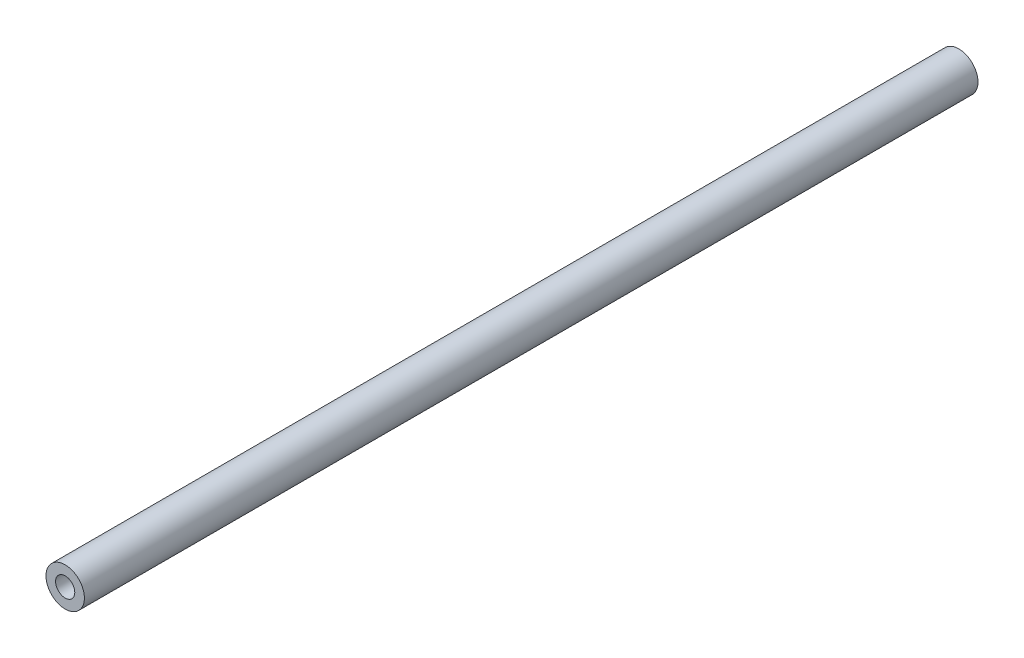
ISO-10303-21;
HEADER;
FILE_DESCRIPTION(('STEP AP214'),'2;1');
FILE_NAME('part.step','',(''),(''),'','','');
FILE_SCHEMA(('AUTOMOTIVE_DESIGN { 1 0 10303 214 1 1 1 1 }'));
ENDSEC;
DATA;
#1=APPLICATION_CONTEXT('core data for automotive mechanical design processes');
#2=APPLICATION_PROTOCOL_DEFINITION('international standard','automotive_design',2000,#1);
#3=PRODUCT_CONTEXT('',#1,'mechanical');
#4=PRODUCT('Part','Part','',(#3));
#5=PRODUCT_RELATED_PRODUCT_CATEGORY('part','',(#4));
#6=PRODUCT_DEFINITION_FORMATION('','',#4);
#7=PRODUCT_DEFINITION_CONTEXT('part definition',#1,'design');
#8=PRODUCT_DEFINITION('design','',#6,#7);
#9=PRODUCT_DEFINITION_SHAPE('','',#8);
#10=(LENGTH_UNIT() NAMED_UNIT(*) SI_UNIT(.MILLI.,.METRE.));
#11=(NAMED_UNIT(*) PLANE_ANGLE_UNIT() SI_UNIT($,.RADIAN.));
#12=(NAMED_UNIT(*) SI_UNIT($,.STERADIAN.) SOLID_ANGLE_UNIT());
#13=UNCERTAINTY_MEASURE_WITH_UNIT(LENGTH_MEASURE(1.E-05),#10,'distance_accuracy_value','');
#14=(GEOMETRIC_REPRESENTATION_CONTEXT(3) GLOBAL_UNCERTAINTY_ASSIGNED_CONTEXT((#13)) GLOBAL_UNIT_ASSIGNED_CONTEXT((#10,
#11,#12)) REPRESENTATION_CONTEXT('',''));
#15=CARTESIAN_POINT('',(0.,0.,0.));
#16=DIRECTION('',(0.,0.,1.));
#17=DIRECTION('',(1.,0.,0.));
#18=AXIS2_PLACEMENT_3D('',#15,#16,#17);
#19=CARTESIAN_POINT('',(0.,0.,23.2633266250382));
#20=DIRECTION('',(0.,0.,1.));
#21=DIRECTION('',(1.,0.,0.));
#22=AXIS2_PLACEMENT_3D('',#19,#20,#21);
#23=PLANE('',#22);
#24=CARTESIAN_POINT('',(0.,0.,23.2633266250382));
#25=DIRECTION('',(0.,0.,1.));
#26=DIRECTION('',(1.,0.,0.));
#27=AXIS2_PLACEMENT_3D('',#24,#25,#26);
#28=CIRCLE('',#27,1.);
#29=CARTESIAN_POINT('',(1.,0.,23.2633266250382));
#30=VERTEX_POINT('',#29);
#31=EDGE_CURVE('E10',#30,#30,#28,.T.);
#32=ORIENTED_EDGE('',*,*,#31,.T.);
#33=EDGE_LOOP('',(#32));
#34=FACE_BOUND('',#33,.T.);
#35=CARTESIAN_POINT('',(0.,0.,23.2633266250382));
#36=DIRECTION('',(0.,0.,1.));
#37=DIRECTION('',(1.,0.,0.));
#38=AXIS2_PLACEMENT_3D('',#35,#36,#37);
#39=CIRCLE('',#38,0.5);
#40=CARTESIAN_POINT('',(0.5,0.,23.2633266250382));
#41=VERTEX_POINT('',#40);
#42=EDGE_CURVE('E49',#41,#41,#39,.T.);
#43=ORIENTED_EDGE('',*,*,#42,.F.);
#44=EDGE_LOOP('',(#43));
#45=FACE_BOUND('',#44,.T.);
#46=ADVANCED_FACE('F39',(#34,#45),#23,.T.);
#47=CARTESIAN_POINT('',(0.,0.,-23.2633266250382));
#48=DIRECTION('',(0.,0.,1.));
#49=DIRECTION('',(1.,0.,0.));
#50=AXIS2_PLACEMENT_3D('',#47,#48,#49);
#51=PLANE('',#50);
#52=CARTESIAN_POINT('',(0.,0.,-23.2633266250382));
#53=DIRECTION('',(0.,0.,1.));
#54=DIRECTION('',(1.,0.,0.));
#55=AXIS2_PLACEMENT_3D('',#52,#53,#54);
#56=CIRCLE('',#55,1.);
#57=CARTESIAN_POINT('',(1.,0.,-23.2633266250382));
#58=VERTEX_POINT('',#57);
#59=EDGE_CURVE('E43',#58,#58,#56,.T.);
#60=ORIENTED_EDGE('',*,*,#59,.F.);
#61=EDGE_LOOP('',(#60));
#62=FACE_BOUND('',#61,.T.);
#63=CARTESIAN_POINT('',(0.,0.,-23.2633266250382));
#64=DIRECTION('',(0.,0.,1.));
#65=DIRECTION('',(1.,0.,0.));
#66=AXIS2_PLACEMENT_3D('',#63,#64,#65);
#67=CIRCLE('',#66,0.5);
#68=CARTESIAN_POINT('',(0.5,0.,-23.2633266250382));
#69=VERTEX_POINT('',#68);
#70=EDGE_CURVE('E55',#69,#69,#67,.T.);
#71=ORIENTED_EDGE('',*,*,#70,.T.);
#72=EDGE_LOOP('',(#71));
#73=FACE_BOUND('',#72,.T.);
#74=ADVANCED_FACE('F61',(#62,#73),#51,.F.);
#75=CARTESIAN_POINT('',(0.,0.,23.2633266250382));
#76=DIRECTION('',(0.,0.,-1.));
#77=DIRECTION('',(-1.,0.,0.));
#78=AXIS2_PLACEMENT_3D('',#75,#76,#77);
#79=CYLINDRICAL_SURFACE('',#78,1.);
#80=ORIENTED_EDGE('',*,*,#31,.F.);
#81=EDGE_LOOP('',(#80));
#82=FACE_BOUND('',#81,.T.);
#83=ORIENTED_EDGE('',*,*,#59,.T.);
#84=EDGE_LOOP('',(#83));
#85=FACE_BOUND('',#84,.T.);
#86=ADVANCED_FACE('F41',(#82,#85),#79,.T.);
#87=CARTESIAN_POINT('',(0.,0.,23.2633266250382));
#88=DIRECTION('',(0.,0.,-1.));
#89=DIRECTION('',(-1.,0.,0.));
#90=AXIS2_PLACEMENT_3D('',#87,#88,#89);
#91=CYLINDRICAL_SURFACE('',#90,0.5);
#92=ORIENTED_EDGE('',*,*,#42,.T.);
#93=EDGE_LOOP('',(#92));
#94=FACE_BOUND('',#93,.T.);
#95=ORIENTED_EDGE('',*,*,#70,.F.);
#96=EDGE_LOOP('',(#95));
#97=FACE_BOUND('',#96,.T.);
#98=ADVANCED_FACE('F59',(#94,#97),#91,.F.);
#99=CLOSED_SHELL('',(#46,#74,#86,#98));
#100=MANIFOLD_SOLID_BREP('B2',#99);
#101=ADVANCED_BREP_SHAPE_REPRESENTATION('',(#18,#100),#14);
#102=SHAPE_DEFINITION_REPRESENTATION(#9,#101);
ENDSEC;
END-ISO-10303-21;
